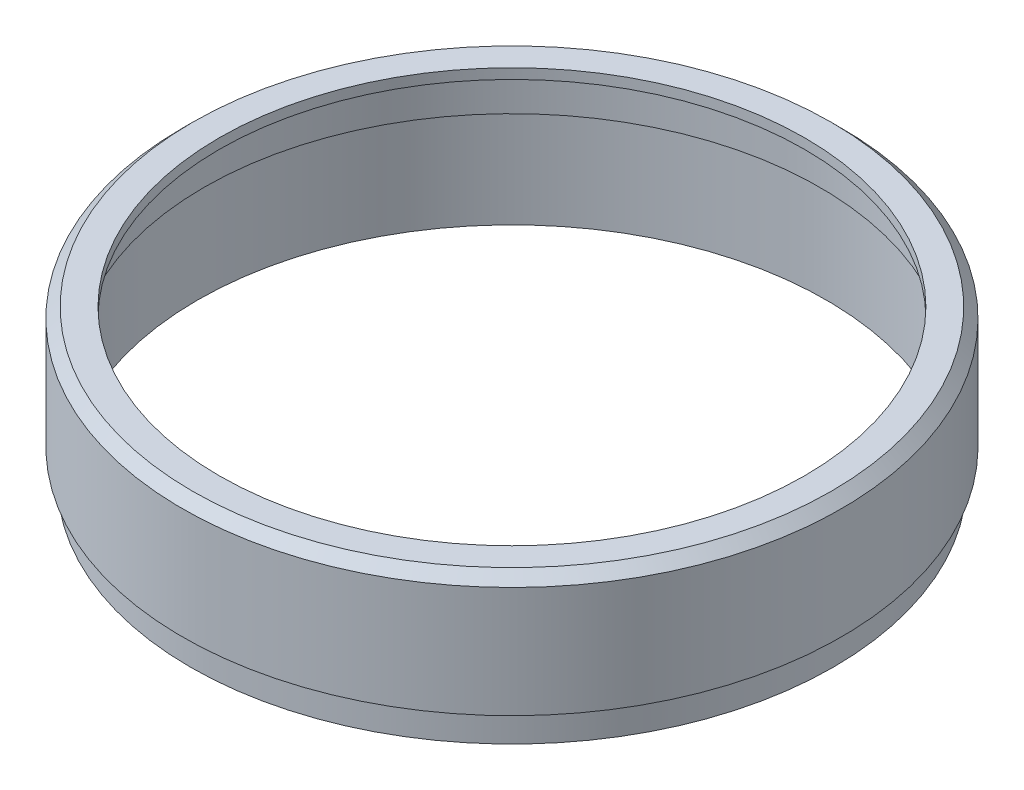
ISO-10303-21;
HEADER;
FILE_DESCRIPTION(('STEP AP214'),'2;1');
FILE_NAME('part.step','',(''),(''),'','','');
FILE_SCHEMA(('AUTOMOTIVE_DESIGN { 1 0 10303 214 1 1 1 1 }'));
ENDSEC;
DATA;
#1=APPLICATION_CONTEXT('core data for automotive mechanical design processes');
#2=APPLICATION_PROTOCOL_DEFINITION('international standard','automotive_design',2000,#1);
#3=PRODUCT_CONTEXT('',#1,'mechanical');
#4=PRODUCT('Part','Part','',(#3));
#5=PRODUCT_RELATED_PRODUCT_CATEGORY('part','',(#4));
#6=PRODUCT_DEFINITION_FORMATION('','',#4);
#7=PRODUCT_DEFINITION_CONTEXT('part definition',#1,'design');
#8=PRODUCT_DEFINITION('design','',#6,#7);
#9=PRODUCT_DEFINITION_SHAPE('','',#8);
#10=(LENGTH_UNIT() NAMED_UNIT(*) SI_UNIT(.MILLI.,.METRE.));
#11=(NAMED_UNIT(*) PLANE_ANGLE_UNIT() SI_UNIT($,.RADIAN.));
#12=(NAMED_UNIT(*) SI_UNIT($,.STERADIAN.) SOLID_ANGLE_UNIT());
#13=UNCERTAINTY_MEASURE_WITH_UNIT(LENGTH_MEASURE(1.E-05),#10,'distance_accuracy_value','');
#14=(GEOMETRIC_REPRESENTATION_CONTEXT(3) GLOBAL_UNCERTAINTY_ASSIGNED_CONTEXT((#13)) GLOBAL_UNIT_ASSIGNED_CONTEXT((#10,
#11,#12)) REPRESENTATION_CONTEXT('',''));
#15=CARTESIAN_POINT('',(0.,0.,0.));
#16=DIRECTION('',(0.,0.,1.));
#17=DIRECTION('',(1.,0.,0.));
#18=AXIS2_PLACEMENT_3D('',#15,#16,#17);
#19=CARTESIAN_POINT('',(0.,0.,0.));
#20=DIRECTION('',(0.,1.,0.));
#21=DIRECTION('',(-1.,0.,0.));
#22=AXIS2_PLACEMENT_3D('',#19,#20,#21);
#23=CYLINDRICAL_SURFACE('',#22,32.65);
#24=CARTESIAN_POINT('',(0.,4.,0.));
#25=DIRECTION('',(0.,1.,0.));
#26=DIRECTION('',(-1.,0.,0.));
#27=AXIS2_PLACEMENT_3D('',#24,#25,#26);
#28=CIRCLE('',#27,32.65);
#29=CARTESIAN_POINT('',(-32.65,4.,0.));
#30=VERTEX_POINT('',#29);
#31=EDGE_CURVE('E10',#30,#30,#28,.T.);
#32=ORIENTED_EDGE('',*,*,#31,.T.);
#33=EDGE_LOOP('',(#32));
#34=FACE_BOUND('',#33,.T.);
#35=CARTESIAN_POINT('',(0.,15.,0.));
#36=DIRECTION('',(0.,1.,0.));
#37=DIRECTION('',(-1.,0.,0.));
#38=AXIS2_PLACEMENT_3D('',#35,#36,#37);
#39=CIRCLE('',#38,32.65);
#40=CARTESIAN_POINT('',(-32.65,15.,0.));
#41=VERTEX_POINT('',#40);
#42=EDGE_CURVE('E68',#41,#41,#39,.T.);
#43=ORIENTED_EDGE('',*,*,#42,.F.);
#44=EDGE_LOOP('',(#43));
#45=FACE_BOUND('',#44,.T.);
#46=ADVANCED_FACE('F31',(#34,#45),#23,.T.);
#47=CARTESIAN_POINT('',(-32.65,4.,0.));
#48=DIRECTION('',(0.,-1.,0.));
#49=DIRECTION('',(1.,0.,0.));
#50=AXIS2_PLACEMENT_3D('',#47,#48,#49);
#51=PLANE('',#50);
#52=CARTESIAN_POINT('',(0.,4.,0.));
#53=DIRECTION('',(0.,1.,0.));
#54=DIRECTION('',(-1.,0.,0.));
#55=AXIS2_PLACEMENT_3D('',#52,#53,#54);
#56=CIRCLE('',#55,31.85);
#57=CARTESIAN_POINT('',(-31.85,4.,0.));
#58=VERTEX_POINT('',#57);
#59=EDGE_CURVE('E37',#58,#58,#56,.T.);
#60=ORIENTED_EDGE('',*,*,#59,.T.);
#61=EDGE_LOOP('',(#60));
#62=FACE_BOUND('',#61,.T.);
#63=ORIENTED_EDGE('',*,*,#31,.F.);
#64=EDGE_LOOP('',(#63));
#65=FACE_BOUND('',#64,.T.);
#66=ADVANCED_FACE('F76',(#62,#65),#51,.T.);
#67=CARTESIAN_POINT('',(0.,0.,0.));
#68=DIRECTION('',(0.,1.,0.));
#69=DIRECTION('',(-1.,0.,0.));
#70=AXIS2_PLACEMENT_3D('',#67,#68,#69);
#71=CYLINDRICAL_SURFACE('',#70,31.85);
#72=CARTESIAN_POINT('',(0.,1.,0.));
#73=DIRECTION('',(0.,1.,0.));
#74=DIRECTION('',(-1.,0.,0.));
#75=AXIS2_PLACEMENT_3D('',#72,#73,#74);
#76=CIRCLE('',#75,31.85);
#77=CARTESIAN_POINT('',(-31.85,1.,0.));
#78=VERTEX_POINT('',#77);
#79=EDGE_CURVE('E41',#78,#78,#76,.T.);
#80=ORIENTED_EDGE('',*,*,#79,.T.);
#81=EDGE_LOOP('',(#80));
#82=FACE_BOUND('',#81,.T.);
#83=ORIENTED_EDGE('',*,*,#59,.F.);
#84=EDGE_LOOP('',(#83));
#85=FACE_BOUND('',#84,.T.);
#86=ADVANCED_FACE('F80',(#82,#85),#71,.T.);
#87=CARTESIAN_POINT('',(-31.85,1.,0.));
#88=DIRECTION('',(0.,-1.,0.));
#89=DIRECTION('',(1.,0.,0.));
#90=AXIS2_PLACEMENT_3D('',#87,#88,#89);
#91=PLANE('',#90);
#92=CARTESIAN_POINT('',(0.,1.,0.));
#93=DIRECTION('',(0.,1.,0.));
#94=DIRECTION('',(-1.,0.,0.));
#95=AXIS2_PLACEMENT_3D('',#92,#93,#94);
#96=CIRCLE('',#95,31.15);
#97=CARTESIAN_POINT('',(-31.15,1.,0.));
#98=VERTEX_POINT('',#97);
#99=EDGE_CURVE('E45',#98,#98,#96,.T.);
#100=ORIENTED_EDGE('',*,*,#99,.T.);
#101=EDGE_LOOP('',(#100));
#102=FACE_BOUND('',#101,.T.);
#103=ORIENTED_EDGE('',*,*,#79,.F.);
#104=EDGE_LOOP('',(#103));
#105=FACE_BOUND('',#104,.T.);
#106=ADVANCED_FACE('F84',(#102,#105),#91,.T.);
#107=CARTESIAN_POINT('',(0.,0.,0.));
#108=DIRECTION('',(0.,1.,0.));
#109=DIRECTION('',(-1.,0.,0.));
#110=AXIS2_PLACEMENT_3D('',#107,#108,#109);
#111=CYLINDRICAL_SURFACE('',#110,31.15);
#112=CARTESIAN_POINT('',(0.,11.,0.));
#113=DIRECTION('',(0.,1.,0.));
#114=DIRECTION('',(-1.,0.,0.));
#115=AXIS2_PLACEMENT_3D('',#112,#113,#114);
#116=CIRCLE('',#115,31.15);
#117=CARTESIAN_POINT('',(-31.15,11.,0.));
#118=VERTEX_POINT('',#117);
#119=EDGE_CURVE('E50',#118,#118,#116,.T.);
#120=ORIENTED_EDGE('',*,*,#119,.T.);
#121=EDGE_LOOP('',(#120));
#122=FACE_BOUND('',#121,.T.);
#123=ORIENTED_EDGE('',*,*,#99,.F.);
#124=EDGE_LOOP('',(#123));
#125=FACE_BOUND('',#124,.T.);
#126=ADVANCED_FACE('F91',(#122,#125),#111,.F.);
#127=CARTESIAN_POINT('',(-31.15,11.,0.));
#128=DIRECTION('',(0.,-1.,0.));
#129=DIRECTION('',(1.,0.,0.));
#130=AXIS2_PLACEMENT_3D('',#127,#128,#129);
#131=PLANE('',#130);
#132=CARTESIAN_POINT('',(0.,11.,0.));
#133=DIRECTION('',(0.,1.,0.));
#134=DIRECTION('',(-1.,0.,0.));
#135=AXIS2_PLACEMENT_3D('',#132,#133,#134);
#136=CIRCLE('',#135,30.5);
#137=CARTESIAN_POINT('',(-30.5,11.,0.));
#138=VERTEX_POINT('',#137);
#139=EDGE_CURVE('E53',#138,#138,#136,.T.);
#140=ORIENTED_EDGE('',*,*,#139,.T.);
#141=EDGE_LOOP('',(#140));
#142=FACE_BOUND('',#141,.T.);
#143=ORIENTED_EDGE('',*,*,#119,.F.);
#144=EDGE_LOOP('',(#143));
#145=FACE_BOUND('',#144,.T.);
#146=ADVANCED_FACE('F95',(#142,#145),#131,.T.);
#147=CARTESIAN_POINT('',(0.,0.,0.));
#148=DIRECTION('',(0.,1.,0.));
#149=DIRECTION('',(-1.,0.,0.));
#150=AXIS2_PLACEMENT_3D('',#147,#148,#149);
#151=CYLINDRICAL_SURFACE('',#150,30.5);
#152=CARTESIAN_POINT('',(0.,15.,0.));
#153=DIRECTION('',(0.,1.,0.));
#154=DIRECTION('',(-1.,0.,0.));
#155=AXIS2_PLACEMENT_3D('',#152,#153,#154);
#156=CIRCLE('',#155,30.5);
#157=CARTESIAN_POINT('',(-30.5,15.,0.));
#158=VERTEX_POINT('',#157);
#159=EDGE_CURVE('E56',#158,#158,#156,.T.);
#160=ORIENTED_EDGE('',*,*,#159,.T.);
#161=EDGE_LOOP('',(#160));
#162=FACE_BOUND('',#161,.T.);
#163=ORIENTED_EDGE('',*,*,#139,.F.);
#164=EDGE_LOOP('',(#163));
#165=FACE_BOUND('',#164,.T.);
#166=ADVANCED_FACE('F99',(#162,#165),#151,.F.);
#167=CARTESIAN_POINT('',(-30.5,15.,0.));
#168=DIRECTION('',(0.,-1.,0.));
#169=DIRECTION('',(1.,0.,0.));
#170=AXIS2_PLACEMENT_3D('',#167,#168,#169);
#171=PLANE('',#170);
#172=CARTESIAN_POINT('',(0.,15.,0.));
#173=DIRECTION('',(0.,1.,0.));
#174=DIRECTION('',(-1.,0.,0.));
#175=AXIS2_PLACEMENT_3D('',#172,#173,#174);
#176=CIRCLE('',#175,29.);
#177=CARTESIAN_POINT('',(-29.,15.,0.));
#178=VERTEX_POINT('',#177);
#179=EDGE_CURVE('E59',#178,#178,#176,.T.);
#180=ORIENTED_EDGE('',*,*,#179,.T.);
#181=EDGE_LOOP('',(#180));
#182=FACE_BOUND('',#181,.T.);
#183=ORIENTED_EDGE('',*,*,#159,.F.);
#184=EDGE_LOOP('',(#183));
#185=FACE_BOUND('',#184,.T.);
#186=ADVANCED_FACE('F103',(#182,#185),#171,.T.);
#187=CARTESIAN_POINT('',(0.,0.,0.));
#188=DIRECTION('',(0.,1.,0.));
#189=DIRECTION('',(-1.,0.,0.));
#190=AXIS2_PLACEMENT_3D('',#187,#188,#189);
#191=CYLINDRICAL_SURFACE('',#190,29.);
#192=CARTESIAN_POINT('',(0.,16.,0.));
#193=DIRECTION('',(0.,1.,0.));
#194=DIRECTION('',(-1.,0.,0.));
#195=AXIS2_PLACEMENT_3D('',#192,#193,#194);
#196=CIRCLE('',#195,29.);
#197=CARTESIAN_POINT('',(-29.,16.,0.));
#198=VERTEX_POINT('',#197);
#199=EDGE_CURVE('E62',#198,#198,#196,.T.);
#200=ORIENTED_EDGE('',*,*,#199,.T.);
#201=EDGE_LOOP('',(#200));
#202=FACE_BOUND('',#201,.T.);
#203=ORIENTED_EDGE('',*,*,#179,.F.);
#204=EDGE_LOOP('',(#203));
#205=FACE_BOUND('',#204,.T.);
#206=ADVANCED_FACE('F107',(#202,#205),#191,.F.);
#207=CARTESIAN_POINT('',(-29.,16.,0.));
#208=DIRECTION('',(0.,1.,0.));
#209=DIRECTION('',(-1.,0.,0.));
#210=AXIS2_PLACEMENT_3D('',#207,#208,#209);
#211=PLANE('',#210);
#212=CARTESIAN_POINT('',(0.,16.,0.));
#213=DIRECTION('',(0.,1.,0.));
#214=DIRECTION('',(-1.,0.,0.));
#215=AXIS2_PLACEMENT_3D('',#212,#213,#214);
#216=CIRCLE('',#215,31.65);
#217=CARTESIAN_POINT('',(-31.65,16.,0.));
#218=VERTEX_POINT('',#217);
#219=EDGE_CURVE('E65',#218,#218,#216,.T.);
#220=ORIENTED_EDGE('',*,*,#219,.T.);
#221=EDGE_LOOP('',(#220));
#222=FACE_BOUND('',#221,.T.);
#223=ORIENTED_EDGE('',*,*,#199,.F.);
#224=EDGE_LOOP('',(#223));
#225=FACE_BOUND('',#224,.T.);
#226=ADVANCED_FACE('F111',(#222,#225),#211,.T.);
#227=CARTESIAN_POINT('',(0.,16.,0.));
#228=DIRECTION('',(0.,-1.,0.));
#229=DIRECTION('',(1.,0.,0.));
#230=AXIS2_PLACEMENT_3D('',#227,#228,#229);
#231=CONICAL_SURFACE('',#230,31.65,0.785398163397445);
#232=ORIENTED_EDGE('',*,*,#42,.T.);
#233=EDGE_LOOP('',(#232));
#234=FACE_BOUND('',#233,.T.);
#235=ORIENTED_EDGE('',*,*,#219,.F.);
#236=EDGE_LOOP('',(#235));
#237=FACE_BOUND('',#236,.T.);
#238=ADVANCED_FACE('F72',(#234,#237),#231,.T.);
#239=CLOSED_SHELL('',(#46,#66,#86,#106,#126,#146,#166,#186,#206,#226,#238));
#240=MANIFOLD_SOLID_BREP('B2',#239);
#241=ADVANCED_BREP_SHAPE_REPRESENTATION('',(#18,#240),#14);
#242=SHAPE_DEFINITION_REPRESENTATION(#9,#241);
ENDSEC;
END-ISO-10303-21;
